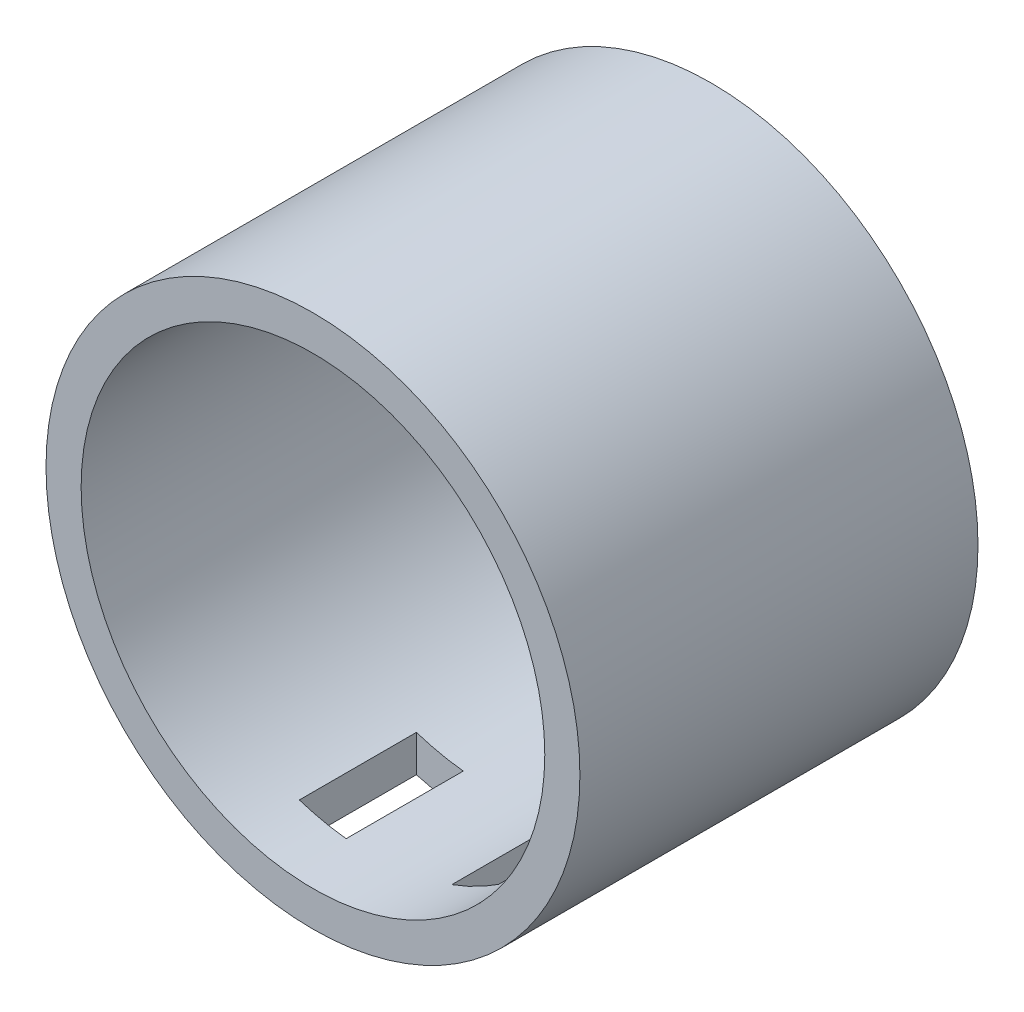
ISO-10303-21;
HEADER;
FILE_DESCRIPTION(('STEP AP214'),'2;1');
FILE_NAME('part.step','',(''),(''),'','','');
FILE_SCHEMA(('AUTOMOTIVE_DESIGN { 1 0 10303 214 1 1 1 1 }'));
ENDSEC;
DATA;
#1=APPLICATION_CONTEXT('core data for automotive mechanical design processes');
#2=APPLICATION_PROTOCOL_DEFINITION('international standard','automotive_design',2000,#1);
#3=PRODUCT_CONTEXT('',#1,'mechanical');
#4=PRODUCT('Part','Part','',(#3));
#5=PRODUCT_RELATED_PRODUCT_CATEGORY('part','',(#4));
#6=PRODUCT_DEFINITION_FORMATION('','',#4);
#7=PRODUCT_DEFINITION_CONTEXT('part definition',#1,'design');
#8=PRODUCT_DEFINITION('design','',#6,#7);
#9=PRODUCT_DEFINITION_SHAPE('','',#8);
#10=(LENGTH_UNIT() NAMED_UNIT(*) SI_UNIT(.MILLI.,.METRE.));
#11=(NAMED_UNIT(*) PLANE_ANGLE_UNIT() SI_UNIT($,.RADIAN.));
#12=(NAMED_UNIT(*) SI_UNIT($,.STERADIAN.) SOLID_ANGLE_UNIT());
#13=UNCERTAINTY_MEASURE_WITH_UNIT(LENGTH_MEASURE(1.E-05),#10,'distance_accuracy_value','');
#14=(GEOMETRIC_REPRESENTATION_CONTEXT(3) GLOBAL_UNCERTAINTY_ASSIGNED_CONTEXT((#13)) GLOBAL_UNIT_ASSIGNED_CONTEXT((#10,
#11,#12)) REPRESENTATION_CONTEXT('',''));
#15=CARTESIAN_POINT('',(0.,0.,0.));
#16=DIRECTION('',(0.,0.,1.));
#17=DIRECTION('',(1.,0.,0.));
#18=AXIS2_PLACEMENT_3D('',#15,#16,#17);
#19=CARTESIAN_POINT('',(0.,0.,15.));
#20=DIRECTION('',(0.,0.,1.));
#21=DIRECTION('',(1.,0.,0.));
#22=AXIS2_PLACEMENT_3D('',#19,#20,#21);
#23=PLANE('',#22);
#24=CARTESIAN_POINT('',(0.,0.,15.));
#25=DIRECTION('',(0.,0.,1.));
#26=DIRECTION('',(1.,0.,0.));
#27=AXIS2_PLACEMENT_3D('',#24,#25,#26);
#28=CIRCLE('',#27,11.4);
#29=CARTESIAN_POINT('',(11.4,0.,15.));
#30=VERTEX_POINT('',#29);
#31=EDGE_CURVE('E148',#30,#30,#28,.T.);
#32=ORIENTED_EDGE('',*,*,#31,.T.);
#33=EDGE_LOOP('',(#32));
#34=FACE_BOUND('',#33,.T.);
#35=CARTESIAN_POINT('',(0.,0.,15.));
#36=DIRECTION('',(0.,0.,1.));
#37=DIRECTION('',(1.,0.,0.));
#38=AXIS2_PLACEMENT_3D('',#35,#36,#37);
#39=CIRCLE('',#38,9.9);
#40=CARTESIAN_POINT('',(9.9,0.,15.));
#41=VERTEX_POINT('',#40);
#42=EDGE_CURVE('E145',#41,#41,#39,.T.);
#43=ORIENTED_EDGE('',*,*,#42,.F.);
#44=EDGE_LOOP('',(#43));
#45=FACE_BOUND('',#44,.T.);
#46=ADVANCED_FACE('F33',(#34,#45),#23,.T.);
#47=CARTESIAN_POINT('',(0.,0.,15.));
#48=DIRECTION('',(0.,0.,-1.));
#49=DIRECTION('',(-1.,0.,0.));
#50=AXIS2_PLACEMENT_3D('',#47,#48,#49);
#51=CYLINDRICAL_SURFACE('',#50,11.4);
#52=CARTESIAN_POINT('',(0.,0.,12.5029632110469));
#53=DIRECTION('',(0.,0.,1.));
#54=DIRECTION('',(1.,0.,0.));
#55=AXIS2_PLACEMENT_3D('',#52,#53,#54);
#56=CIRCLE('',#55,11.4);
#57=CARTESIAN_POINT('',(3.43129085398974,-10.8713496436885,12.5029632110469));
#58=VERTEX_POINT('',#57);
#59=CARTESIAN_POINT('',(5.43129085398974,-10.0230274697502,12.5029632110469));
#60=VERTEX_POINT('',#59);
#61=EDGE_CURVE('E129',#58,#60,#56,.T.);
#62=ORIENTED_EDGE('',*,*,#61,.T.);
#63=DIRECTION('',(0.,0.,-1.));
#64=VECTOR('',#63,1.);
#65=CARTESIAN_POINT('',(5.43129085398974,-10.0230274697502,15.));
#66=LINE('',#65,#64);
#67=CARTESIAN_POINT('',(5.43129085398974,-10.0230274697502,7.50296321104694));
#68=VERTEX_POINT('',#67);
#69=EDGE_CURVE('E132',#60,#68,#66,.T.);
#70=ORIENTED_EDGE('',*,*,#69,.T.);
#71=CARTESIAN_POINT('',(0.,0.,7.50296321104693));
#72=DIRECTION('',(0.,0.,-1.));
#73=DIRECTION('',(-1.,0.,0.));
#74=AXIS2_PLACEMENT_3D('',#71,#72,#73);
#75=CIRCLE('',#74,11.4);
#76=CARTESIAN_POINT('',(3.43129085398974,-10.8713496436885,7.50296321104693));
#77=VERTEX_POINT('',#76);
#78=EDGE_CURVE('E119',#68,#77,#75,.T.);
#79=ORIENTED_EDGE('',*,*,#78,.T.);
#80=DIRECTION('',(0.,0.,-1.));
#81=VECTOR('',#80,1.);
#82=CARTESIAN_POINT('',(3.43129085398974,-10.8713496436885,15.));
#83=LINE('',#82,#81);
#84=EDGE_CURVE('E122',#77,#58,#83,.F.);
#85=ORIENTED_EDGE('',*,*,#84,.T.);
#86=EDGE_LOOP('',(#62,#70,#79,#85));
#87=FACE_BOUND('',#86,.T.);
#88=CARTESIAN_POINT('',(0.,0.,12.5029632110469));
#89=DIRECTION('',(0.,0.,1.));
#90=DIRECTION('',(1.,0.,0.));
#91=AXIS2_PLACEMENT_3D('',#88,#89,#90);
#92=CIRCLE('',#91,11.4);
#93=CARTESIAN_POINT('',(-3.07865824330911,-10.9764230704226,12.5029632110469));
#94=VERTEX_POINT('',#93);
#95=CARTESIAN_POINT('',(-1.07865824330911,-11.3488544088882,12.5029632110469));
#96=VERTEX_POINT('',#95);
#97=EDGE_CURVE('E118',#94,#96,#92,.T.);
#98=ORIENTED_EDGE('',*,*,#97,.T.);
#99=DIRECTION('',(0.,0.,-1.));
#100=VECTOR('',#99,1.);
#101=CARTESIAN_POINT('',(-1.07865824330911,-11.3488544088882,15.));
#102=LINE('',#101,#100);
#103=CARTESIAN_POINT('',(-1.07865824330911,-11.3488544088882,7.50296321104693));
#104=VERTEX_POINT('',#103);
#105=EDGE_CURVE('E110',#96,#104,#102,.T.);
#106=ORIENTED_EDGE('',*,*,#105,.T.);
#107=CARTESIAN_POINT('',(0.,0.,7.50296321104693));
#108=DIRECTION('',(0.,0.,-1.));
#109=DIRECTION('',(-1.,0.,0.));
#110=AXIS2_PLACEMENT_3D('',#107,#108,#109);
#111=CIRCLE('',#110,11.4);
#112=CARTESIAN_POINT('',(-3.07865824330911,-10.9764230704226,7.50296321104694));
#113=VERTEX_POINT('',#112);
#114=EDGE_CURVE('E96',#104,#113,#111,.T.);
#115=ORIENTED_EDGE('',*,*,#114,.T.);
#116=DIRECTION('',(0.,0.,-1.));
#117=VECTOR('',#116,1.);
#118=CARTESIAN_POINT('',(-3.07865824330911,-10.9764230704226,15.));
#119=LINE('',#118,#117);
#120=EDGE_CURVE('E104',#113,#94,#119,.F.);
#121=ORIENTED_EDGE('',*,*,#120,.T.);
#122=EDGE_LOOP('',(#98,#106,#115,#121));
#123=FACE_BOUND('',#122,.T.);
#124=ORIENTED_EDGE('',*,*,#31,.F.);
#125=EDGE_LOOP('',(#124));
#126=FACE_BOUND('',#125,.T.);
#127=CARTESIAN_POINT('',(0.,0.,-2.));
#128=DIRECTION('',(0.,0.,-1.));
#129=DIRECTION('',(-1.,0.,0.));
#130=AXIS2_PLACEMENT_3D('',#127,#128,#129);
#131=CIRCLE('',#130,11.4);
#132=CARTESIAN_POINT('',(-11.4,0.,-2.));
#133=VERTEX_POINT('',#132);
#134=EDGE_CURVE('E139',#133,#133,#131,.T.);
#135=ORIENTED_EDGE('',*,*,#134,.F.);
#136=EDGE_LOOP('',(#135));
#137=FACE_BOUND('',#136,.T.);
#138=ADVANCED_FACE('F35',(#87,#123,#126,#137),#51,.T.);
#139=CARTESIAN_POINT('',(0.,0.,15.));
#140=DIRECTION('',(0.,0.,-1.));
#141=DIRECTION('',(-1.,0.,0.));
#142=AXIS2_PLACEMENT_3D('',#139,#140,#141);
#143=CYLINDRICAL_SURFACE('',#142,9.9);
#144=DIRECTION('',(0.,0.,-1.));
#145=VECTOR('',#144,1.);
#146=CARTESIAN_POINT('',(5.43129085398974,-8.27714199826047,15.));
#147=LINE('',#146,#145);
#148=CARTESIAN_POINT('',(5.43129085398974,-8.27714199826047,12.5029632110469));
#149=VERTEX_POINT('',#148);
#150=CARTESIAN_POINT('',(5.43129085398974,-8.27714199826047,7.50296321104694));
#151=VERTEX_POINT('',#150);
#152=EDGE_CURVE('E11',#149,#151,#147,.T.);
#153=ORIENTED_EDGE('',*,*,#152,.F.);
#154=CARTESIAN_POINT('',(0.,0.,12.5029632110469));
#155=DIRECTION('',(0.,0.,1.));
#156=DIRECTION('',(1.,0.,0.));
#157=AXIS2_PLACEMENT_3D('',#154,#155,#156);
#158=CIRCLE('',#157,9.9);
#159=CARTESIAN_POINT('',(3.43129085398974,-9.28634713304033,12.5029632110469));
#160=VERTEX_POINT('',#159);
#161=EDGE_CURVE('E41',#160,#149,#158,.T.);
#162=ORIENTED_EDGE('',*,*,#161,.F.);
#163=DIRECTION('',(0.,0.,-1.));
#164=VECTOR('',#163,1.);
#165=CARTESIAN_POINT('',(3.43129085398974,-9.28634713304033,15.));
#166=LINE('',#165,#164);
#167=CARTESIAN_POINT('',(3.43129085398974,-9.28634713304033,7.50296321104693));
#168=VERTEX_POINT('',#167);
#169=EDGE_CURVE('E162',#168,#160,#166,.F.);
#170=ORIENTED_EDGE('',*,*,#169,.F.);
#171=CARTESIAN_POINT('',(0.,0.,7.50296321104693));
#172=DIRECTION('',(0.,0.,-1.));
#173=DIRECTION('',(-1.,0.,0.));
#174=AXIS2_PLACEMENT_3D('',#171,#172,#173);
#175=CIRCLE('',#174,9.9);
#176=EDGE_CURVE('E160',#151,#168,#175,.T.);
#177=ORIENTED_EDGE('',*,*,#176,.F.);
#178=EDGE_LOOP('',(#153,#162,#170,#177));
#179=FACE_BOUND('',#178,.T.);
#180=DIRECTION('',(0.,0.,-1.));
#181=VECTOR('',#180,1.);
#182=CARTESIAN_POINT('',(-1.07865824330911,-9.84106175136308,15.));
#183=LINE('',#182,#181);
#184=CARTESIAN_POINT('',(-1.07865824330911,-9.84106175136308,12.5029632110469));
#185=VERTEX_POINT('',#184);
#186=CARTESIAN_POINT('',(-1.07865824330911,-9.84106175136308,7.50296321104693));
#187=VERTEX_POINT('',#186);
#188=EDGE_CURVE('E113',#185,#187,#183,.T.);
#189=ORIENTED_EDGE('',*,*,#188,.F.);
#190=CARTESIAN_POINT('',(0.,0.,12.5029632110469));
#191=DIRECTION('',(0.,0.,1.));
#192=DIRECTION('',(1.,0.,0.));
#193=AXIS2_PLACEMENT_3D('',#190,#191,#192);
#194=CIRCLE('',#193,9.9);
#195=CARTESIAN_POINT('',(-3.07865824330911,-9.40913723042155,12.5029632110469));
#196=VERTEX_POINT('',#195);
#197=EDGE_CURVE('E157',#196,#185,#194,.T.);
#198=ORIENTED_EDGE('',*,*,#197,.F.);
#199=DIRECTION('',(0.,0.,-1.));
#200=VECTOR('',#199,1.);
#201=CARTESIAN_POINT('',(-3.07865824330911,-9.40913723042155,15.));
#202=LINE('',#201,#200);
#203=CARTESIAN_POINT('',(-3.07865824330911,-9.40913723042155,7.50296321104694));
#204=VERTEX_POINT('',#203);
#205=EDGE_CURVE('E155',#204,#196,#202,.F.);
#206=ORIENTED_EDGE('',*,*,#205,.F.);
#207=CARTESIAN_POINT('',(0.,0.,7.50296321104693));
#208=DIRECTION('',(0.,0.,-1.));
#209=DIRECTION('',(-1.,0.,0.));
#210=AXIS2_PLACEMENT_3D('',#207,#208,#209);
#211=CIRCLE('',#210,9.9);
#212=EDGE_CURVE('E153',#187,#204,#211,.T.);
#213=ORIENTED_EDGE('',*,*,#212,.F.);
#214=EDGE_LOOP('',(#189,#198,#206,#213));
#215=FACE_BOUND('',#214,.T.);
#216=ORIENTED_EDGE('',*,*,#42,.T.);
#217=EDGE_LOOP('',(#216));
#218=FACE_BOUND('',#217,.T.);
#219=CARTESIAN_POINT('',(0.,0.,0.));
#220=DIRECTION('',(0.,0.,1.));
#221=DIRECTION('',(1.,0.,0.));
#222=AXIS2_PLACEMENT_3D('',#219,#220,#221);
#223=CIRCLE('',#222,9.9);
#224=CARTESIAN_POINT('',(9.9,0.,0.));
#225=VERTEX_POINT('',#224);
#226=EDGE_CURVE('E144',#225,#225,#223,.T.);
#227=ORIENTED_EDGE('',*,*,#226,.F.);
#228=EDGE_LOOP('',(#227));
#229=FACE_BOUND('',#228,.T.);
#230=ADVANCED_FACE('F179',(#179,#215,#218,#229),#143,.F.);
#231=CARTESIAN_POINT('',(0.,0.,0.));
#232=DIRECTION('',(0.,0.,-1.));
#233=DIRECTION('',(-1.,0.,0.));
#234=AXIS2_PLACEMENT_3D('',#231,#232,#233);
#235=PLANE('',#234);
#236=CARTESIAN_POINT('',(0.,0.,0.));
#237=DIRECTION('',(0.,0.,-1.));
#238=DIRECTION('',(-1.,0.,0.));
#239=AXIS2_PLACEMENT_3D('',#236,#237,#238);
#240=CIRCLE('',#239,2.5);
#241=CARTESIAN_POINT('',(-2.5,0.,0.));
#242=VERTEX_POINT('',#241);
#243=EDGE_CURVE('E135',#242,#242,#240,.T.);
#244=ORIENTED_EDGE('',*,*,#243,.T.);
#245=EDGE_LOOP('',(#244));
#246=FACE_BOUND('',#245,.T.);
#247=ORIENTED_EDGE('',*,*,#226,.T.);
#248=EDGE_LOOP('',(#247));
#249=FACE_BOUND('',#248,.T.);
#250=ADVANCED_FACE('F203',(#246,#249),#235,.F.);
#251=CARTESIAN_POINT('',(0.,0.,-2.));
#252=DIRECTION('',(0.,0.,-1.));
#253=DIRECTION('',(-1.,0.,0.));
#254=AXIS2_PLACEMENT_3D('',#251,#252,#253);
#255=PLANE('',#254);
#256=ORIENTED_EDGE('',*,*,#134,.T.);
#257=EDGE_LOOP('',(#256));
#258=FACE_BOUND('',#257,.T.);
#259=CARTESIAN_POINT('',(0.,0.,-2.));
#260=DIRECTION('',(0.,0.,-1.));
#261=DIRECTION('',(-1.,0.,0.));
#262=AXIS2_PLACEMENT_3D('',#259,#260,#261);
#263=CIRCLE('',#262,2.5);
#264=CARTESIAN_POINT('',(-2.5,0.,-2.));
#265=VERTEX_POINT('',#264);
#266=EDGE_CURVE('E136',#265,#265,#263,.T.);
#267=ORIENTED_EDGE('',*,*,#266,.F.);
#268=EDGE_LOOP('',(#267));
#269=FACE_BOUND('',#268,.T.);
#270=ADVANCED_FACE('F210',(#258,#269),#255,.T.);
#271=CARTESIAN_POINT('',(0.,0.,-2.));
#272=DIRECTION('',(0.,0.,1.));
#273=DIRECTION('',(1.,0.,0.));
#274=AXIS2_PLACEMENT_3D('',#271,#272,#273);
#275=CYLINDRICAL_SURFACE('',#274,2.5);
#276=ORIENTED_EDGE('',*,*,#266,.T.);
#277=EDGE_LOOP('',(#276));
#278=FACE_BOUND('',#277,.T.);
#279=ORIENTED_EDGE('',*,*,#243,.F.);
#280=EDGE_LOOP('',(#279));
#281=FACE_BOUND('',#280,.T.);
#282=ADVANCED_FACE('F216',(#278,#281),#275,.F.);
#283=CARTESIAN_POINT('',(-1.07865824330911,-21.,12.5029632110469));
#284=DIRECTION('',(1.,0.,0.));
#285=DIRECTION('',(0.,0.,-1.));
#286=AXIS2_PLACEMENT_3D('',#283,#284,#285);
#287=PLANE('',#286);
#288=DIRECTION('',(0.,1.,0.));
#289=VECTOR('',#288,1.);
#290=CARTESIAN_POINT('',(-1.07865824330911,-21.,12.5029632110469));
#291=LINE('',#290,#289);
#292=EDGE_CURVE('E187',#96,#185,#291,.T.);
#293=ORIENTED_EDGE('',*,*,#292,.T.);
#294=ORIENTED_EDGE('',*,*,#188,.T.);
#295=DIRECTION('',(0.,1.,0.));
#296=VECTOR('',#295,1.);
#297=CARTESIAN_POINT('',(-1.07865824330911,-21.,7.50296321104693));
#298=LINE('',#297,#296);
#299=EDGE_CURVE('E99',#104,#187,#298,.T.);
#300=ORIENTED_EDGE('',*,*,#299,.F.);
#301=ORIENTED_EDGE('',*,*,#105,.F.);
#302=EDGE_LOOP('',(#293,#294,#300,#301));
#303=FACE_BOUND('',#302,.T.);
#304=ADVANCED_FACE('F109',(#303),#287,.F.);
#305=CARTESIAN_POINT('',(-1.07865824330911,-21.,12.5029632110469));
#306=DIRECTION('',(0.,0.,1.));
#307=DIRECTION('',(1.,0.,0.));
#308=AXIS2_PLACEMENT_3D('',#305,#306,#307);
#309=PLANE('',#308);
#310=DIRECTION('',(0.,1.,0.));
#311=VECTOR('',#310,1.);
#312=CARTESIAN_POINT('',(-3.07865824330911,-21.,12.5029632110469));
#313=LINE('',#312,#311);
#314=EDGE_CURVE('E191',#94,#196,#313,.T.);
#315=ORIENTED_EDGE('',*,*,#314,.T.);
#316=ORIENTED_EDGE('',*,*,#197,.T.);
#317=ORIENTED_EDGE('',*,*,#292,.F.);
#318=ORIENTED_EDGE('',*,*,#97,.F.);
#319=EDGE_LOOP('',(#315,#316,#317,#318));
#320=FACE_BOUND('',#319,.T.);
#321=ADVANCED_FACE('F200',(#320),#309,.F.);
#322=CARTESIAN_POINT('',(-3.07865824330911,-21.,12.5029632110469));
#323=DIRECTION('',(-1.,0.,0.));
#324=DIRECTION('',(0.,0.,1.));
#325=AXIS2_PLACEMENT_3D('',#322,#323,#324);
#326=PLANE('',#325);
#327=DIRECTION('',(0.,1.,0.));
#328=VECTOR('',#327,1.);
#329=CARTESIAN_POINT('',(-3.07865824330911,-21.,7.50296321104694));
#330=LINE('',#329,#328);
#331=EDGE_CURVE('E56',#113,#204,#330,.T.);
#332=ORIENTED_EDGE('',*,*,#331,.T.);
#333=ORIENTED_EDGE('',*,*,#205,.T.);
#334=ORIENTED_EDGE('',*,*,#314,.F.);
#335=ORIENTED_EDGE('',*,*,#120,.F.);
#336=EDGE_LOOP('',(#332,#333,#334,#335));
#337=FACE_BOUND('',#336,.T.);
#338=ADVANCED_FACE('F196',(#337),#326,.F.);
#339=CARTESIAN_POINT('',(-1.07865824330911,-21.,7.50296321104693));
#340=DIRECTION('',(0.,0.,-1.));
#341=DIRECTION('',(-1.,0.,0.));
#342=AXIS2_PLACEMENT_3D('',#339,#340,#341);
#343=PLANE('',#342);
#344=ORIENTED_EDGE('',*,*,#299,.T.);
#345=ORIENTED_EDGE('',*,*,#212,.T.);
#346=ORIENTED_EDGE('',*,*,#331,.F.);
#347=ORIENTED_EDGE('',*,*,#114,.F.);
#348=EDGE_LOOP('',(#344,#345,#346,#347));
#349=FACE_BOUND('',#348,.T.);
#350=ADVANCED_FACE('F98',(#349),#343,.F.);
#351=CARTESIAN_POINT('',(5.43129085398974,-21.,12.5029632110469));
#352=DIRECTION('',(1.,0.,0.));
#353=DIRECTION('',(0.,0.,-1.));
#354=AXIS2_PLACEMENT_3D('',#351,#352,#353);
#355=PLANE('',#354);
#356=DIRECTION('',(0.,1.,0.));
#357=VECTOR('',#356,1.);
#358=CARTESIAN_POINT('',(5.43129085398974,-21.,12.5029632110469));
#359=LINE('',#358,#357);
#360=EDGE_CURVE('E105',#60,#149,#359,.T.);
#361=ORIENTED_EDGE('',*,*,#360,.T.);
#362=ORIENTED_EDGE('',*,*,#152,.T.);
#363=DIRECTION('',(0.,1.,0.));
#364=VECTOR('',#363,1.);
#365=CARTESIAN_POINT('',(5.43129085398974,-21.,7.50296321104694));
#366=LINE('',#365,#364);
#367=EDGE_CURVE('E182',#68,#151,#366,.T.);
#368=ORIENTED_EDGE('',*,*,#367,.F.);
#369=ORIENTED_EDGE('',*,*,#69,.F.);
#370=EDGE_LOOP('',(#361,#362,#368,#369));
#371=FACE_BOUND('',#370,.T.);
#372=ADVANCED_FACE('F175',(#371),#355,.F.);
#373=CARTESIAN_POINT('',(5.43129085398974,-21.,12.5029632110469));
#374=DIRECTION('',(0.,0.,1.));
#375=DIRECTION('',(1.,0.,0.));
#376=AXIS2_PLACEMENT_3D('',#373,#374,#375);
#377=PLANE('',#376);
#378=DIRECTION('',(0.,1.,0.));
#379=VECTOR('',#378,1.);
#380=CARTESIAN_POINT('',(3.43129085398974,-21.,12.5029632110469));
#381=LINE('',#380,#379);
#382=EDGE_CURVE('E170',#58,#160,#381,.T.);
#383=ORIENTED_EDGE('',*,*,#382,.T.);
#384=ORIENTED_EDGE('',*,*,#161,.T.);
#385=ORIENTED_EDGE('',*,*,#360,.F.);
#386=ORIENTED_EDGE('',*,*,#61,.F.);
#387=EDGE_LOOP('',(#383,#384,#385,#386));
#388=FACE_BOUND('',#387,.T.);
#389=ADVANCED_FACE('F168',(#388),#377,.F.);
#390=CARTESIAN_POINT('',(3.43129085398974,-21.,12.5029632110469));
#391=DIRECTION('',(-1.,0.,0.));
#392=DIRECTION('',(0.,0.,1.));
#393=AXIS2_PLACEMENT_3D('',#390,#391,#392);
#394=PLANE('',#393);
#395=DIRECTION('',(0.,1.,0.));
#396=VECTOR('',#395,1.);
#397=CARTESIAN_POINT('',(3.43129085398974,-21.,7.50296321104693));
#398=LINE('',#397,#396);
#399=EDGE_CURVE('E48',#77,#168,#398,.T.);
#400=ORIENTED_EDGE('',*,*,#399,.T.);
#401=ORIENTED_EDGE('',*,*,#169,.T.);
#402=ORIENTED_EDGE('',*,*,#382,.F.);
#403=ORIENTED_EDGE('',*,*,#84,.F.);
#404=EDGE_LOOP('',(#400,#401,#402,#403));
#405=FACE_BOUND('',#404,.T.);
#406=ADVANCED_FACE('F184',(#405),#394,.F.);
#407=CARTESIAN_POINT('',(5.43129085398974,-21.,7.50296321104694));
#408=DIRECTION('',(0.,0.,-1.));
#409=DIRECTION('',(-1.,0.,0.));
#410=AXIS2_PLACEMENT_3D('',#407,#408,#409);
#411=PLANE('',#410);
#412=ORIENTED_EDGE('',*,*,#367,.T.);
#413=ORIENTED_EDGE('',*,*,#176,.T.);
#414=ORIENTED_EDGE('',*,*,#399,.F.);
#415=ORIENTED_EDGE('',*,*,#78,.F.);
#416=EDGE_LOOP('',(#412,#413,#414,#415));
#417=FACE_BOUND('',#416,.T.);
#418=ADVANCED_FACE('F181',(#417),#411,.F.);
#419=CLOSED_SHELL('',(#46,#138,#230,#250,#270,#282,#304,#321,#338,#350,#372,#389,#406,#418));
#420=MANIFOLD_SOLID_BREP('B2',#419);
#421=ADVANCED_BREP_SHAPE_REPRESENTATION('',(#18,#420),#14);
#422=SHAPE_DEFINITION_REPRESENTATION(#9,#421);
ENDSEC;
END-ISO-10303-21;
